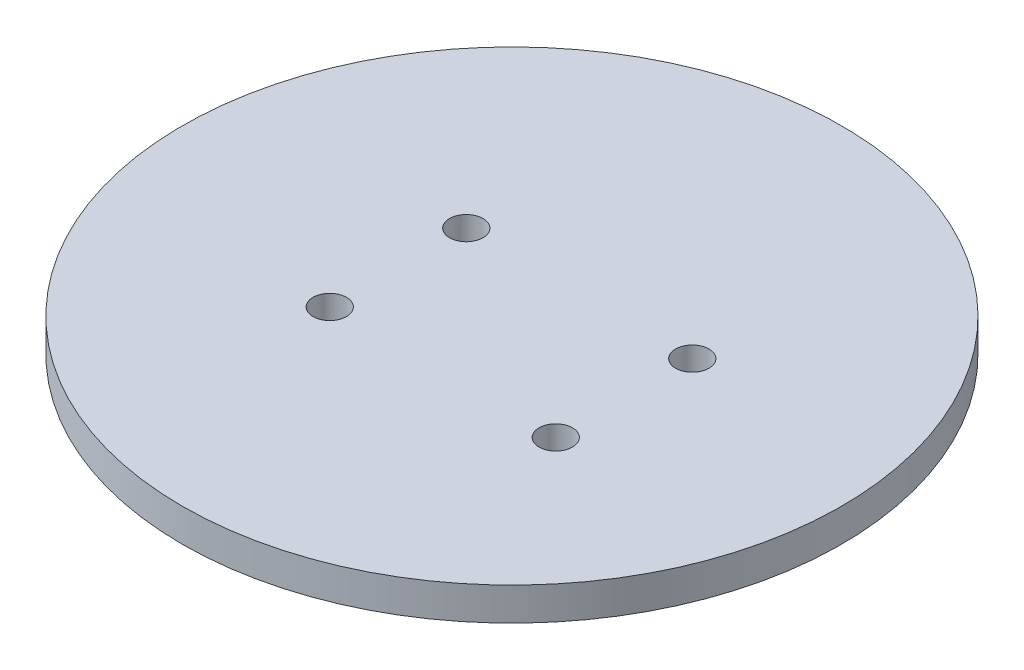
ISO-10303-21;
HEADER;
FILE_DESCRIPTION(('STEP AP214'),'2;1');
FILE_NAME('part.step','',(''),(''),'','','');
FILE_SCHEMA(('AUTOMOTIVE_DESIGN { 1 0 10303 214 1 1 1 1 }'));
ENDSEC;
DATA;
#1=APPLICATION_CONTEXT('core data for automotive mechanical design processes');
#2=APPLICATION_PROTOCOL_DEFINITION('international standard','automotive_design',2000,#1);
#3=PRODUCT_CONTEXT('',#1,'mechanical');
#4=PRODUCT('Part','Part','',(#3));
#5=PRODUCT_RELATED_PRODUCT_CATEGORY('part','',(#4));
#6=PRODUCT_DEFINITION_FORMATION('','',#4);
#7=PRODUCT_DEFINITION_CONTEXT('part definition',#1,'design');
#8=PRODUCT_DEFINITION('design','',#6,#7);
#9=PRODUCT_DEFINITION_SHAPE('','',#8);
#10=(LENGTH_UNIT() NAMED_UNIT(*) SI_UNIT(.MILLI.,.METRE.));
#11=(NAMED_UNIT(*) PLANE_ANGLE_UNIT() SI_UNIT($,.RADIAN.));
#12=(NAMED_UNIT(*) SI_UNIT($,.STERADIAN.) SOLID_ANGLE_UNIT());
#13=UNCERTAINTY_MEASURE_WITH_UNIT(LENGTH_MEASURE(1.E-05),#10,'distance_accuracy_value','');
#14=(GEOMETRIC_REPRESENTATION_CONTEXT(3) GLOBAL_UNCERTAINTY_ASSIGNED_CONTEXT((#13)) GLOBAL_UNIT_ASSIGNED_CONTEXT((#10,
#11,#12)) REPRESENTATION_CONTEXT('',''));
#15=CARTESIAN_POINT('',(0.,0.,0.));
#16=DIRECTION('',(0.,0.,1.));
#17=DIRECTION('',(1.,0.,0.));
#18=AXIS2_PLACEMENT_3D('',#15,#16,#17);
#19=CARTESIAN_POINT('',(0.,-10.2,0.));
#20=DIRECTION('',(0.,1.,0.));
#21=DIRECTION('',(0.,0.,1.));
#22=AXIS2_PLACEMENT_3D('',#19,#20,#21);
#23=PLANE('',#22);
#24=DIRECTION('',(1.,0.,0.));
#25=VECTOR('',#24,1.);
#26=CARTESIAN_POINT('',(2.90000000000001,-10.2,1.6732398693527));
#27=LINE('',#26,#25);
#28=CARTESIAN_POINT('',(-2.89999999999999,-10.2,1.6732398693527));
#29=VERTEX_POINT('',#28);
#30=CARTESIAN_POINT('',(2.90000000000001,-10.2,1.6732398693527));
#31=VERTEX_POINT('',#30);
#32=EDGE_CURVE('E244',#29,#31,#27,.T.);
#33=ORIENTED_EDGE('',*,*,#32,.T.);
#34=DIRECTION('',(0.,0.,-1.));
#35=VECTOR('',#34,1.);
#36=CARTESIAN_POINT('',(2.90000000000001,-10.2,1.6732398693527));
#37=LINE('',#36,#35);
#38=CARTESIAN_POINT('',(2.90000000000001,-10.2,-1.7267601306473));
#39=VERTEX_POINT('',#38);
#40=EDGE_CURVE('E234',#31,#39,#37,.T.);
#41=ORIENTED_EDGE('',*,*,#40,.T.);
#42=DIRECTION('',(-1.,0.,0.));
#43=VECTOR('',#42,1.);
#44=CARTESIAN_POINT('',(2.90000000000001,-10.2,-1.7267601306473));
#45=LINE('',#44,#43);
#46=CARTESIAN_POINT('',(-2.89999999999999,-10.2,-1.7267601306473));
#47=VERTEX_POINT('',#46);
#48=EDGE_CURVE('E237',#39,#47,#45,.T.);
#49=ORIENTED_EDGE('',*,*,#48,.T.);
#50=DIRECTION('',(0.,0.,1.));
#51=VECTOR('',#50,1.);
#52=CARTESIAN_POINT('',(-2.89999999999999,-10.2,1.6732398693527));
#53=LINE('',#52,#51);
#54=EDGE_CURVE('E241',#47,#29,#53,.T.);
#55=ORIENTED_EDGE('',*,*,#54,.T.);
#56=EDGE_LOOP('',(#33,#41,#49,#55));
#57=FACE_BOUND('',#56,.T.);
#58=DIRECTION('',(1.,0.,0.));
#59=VECTOR('',#58,1.);
#60=CARTESIAN_POINT('',(0.,-10.2,2.6732398693527));
#61=LINE('',#60,#59);
#62=CARTESIAN_POINT('',(-2.55808299335717,-10.2,2.6732398693527));
#63=VERTEX_POINT('',#62);
#64=CARTESIAN_POINT('',(2.55808299335717,-10.2,2.6732398693527));
#65=VERTEX_POINT('',#64);
#66=EDGE_CURVE('E177',#63,#65,#61,.T.);
#67=ORIENTED_EDGE('',*,*,#66,.F.);
#68=CARTESIAN_POINT('',(0.,-10.2,0.));
#69=DIRECTION('',(0.,-1.,0.));
#70=DIRECTION('',(0.,0.,-1.));
#71=AXIS2_PLACEMENT_3D('',#68,#69,#70);
#72=CIRCLE('',#71,3.7);
#73=CARTESIAN_POINT('',(-2.50095565532704,-10.2,-2.7267601306473));
#74=VERTEX_POINT('',#73);
#75=EDGE_CURVE('E153',#63,#74,#72,.T.);
#76=ORIENTED_EDGE('',*,*,#75,.T.);
#77=DIRECTION('',(-1.,0.,0.));
#78=VECTOR('',#77,1.);
#79=CARTESIAN_POINT('',(0.,-10.2,-2.7267601306473));
#80=LINE('',#79,#78);
#81=CARTESIAN_POINT('',(2.50095565532704,-10.2,-2.7267601306473));
#82=VERTEX_POINT('',#81);
#83=EDGE_CURVE('E167',#82,#74,#80,.T.);
#84=ORIENTED_EDGE('',*,*,#83,.F.);
#85=EDGE_CURVE('E155',#82,#65,#72,.T.);
#86=ORIENTED_EDGE('',*,*,#85,.T.);
#87=EDGE_LOOP('',(#67,#76,#84,#86));
#88=FACE_BOUND('',#87,.T.);
#89=ADVANCED_FACE('F46',(#57,#88),#23,.F.);
#90=CARTESIAN_POINT('',(0.,-11.2,0.));
#91=DIRECTION('',(0.,1.,0.));
#92=DIRECTION('',(0.,0.,1.));
#93=AXIS2_PLACEMENT_3D('',#90,#91,#92);
#94=CYLINDRICAL_SURFACE('',#93,4.25);
#95=CARTESIAN_POINT('',(0.,-2.2,0.));
#96=DIRECTION('',(0.,-1.,0.));
#97=DIRECTION('',(0.,0.,-1.));
#98=AXIS2_PLACEMENT_3D('',#95,#96,#97);
#99=CIRCLE('',#98,4.25);
#100=CARTESIAN_POINT('',(0.,-2.2,-4.25));
#101=VERTEX_POINT('',#100);
#102=EDGE_CURVE('E202',#101,#101,#99,.T.);
#103=ORIENTED_EDGE('',*,*,#102,.F.);
#104=EDGE_LOOP('',(#103));
#105=FACE_BOUND('',#104,.T.);
#106=DIRECTION('',(0.,1.,0.));
#107=VECTOR('',#106,1.);
#108=CARTESIAN_POINT('',(3.90000000000001,-11.2,-1.68893457540542));
#109=LINE('',#108,#107);
#110=CARTESIAN_POINT('',(3.90000000000001,-3.2,-1.68893457540542));
#111=VERTEX_POINT('',#110);
#112=CARTESIAN_POINT('',(3.90000000000001,-10.2,-1.68893457540542));
#113=VERTEX_POINT('',#112);
#114=EDGE_CURVE('E218',#111,#113,#109,.F.);
#115=ORIENTED_EDGE('',*,*,#114,.T.);
#116=CARTESIAN_POINT('',(0.,-10.2,0.));
#117=DIRECTION('',(0.,-1.,0.));
#118=DIRECTION('',(0.,0.,-1.));
#119=AXIS2_PLACEMENT_3D('',#116,#117,#118);
#120=CIRCLE('',#119,4.25);
#121=CARTESIAN_POINT('',(3.90000000000001,-10.2,1.68893457540544));
#122=VERTEX_POINT('',#121);
#123=EDGE_CURVE('E12',#113,#122,#120,.T.);
#124=ORIENTED_EDGE('',*,*,#123,.T.);
#125=DIRECTION('',(0.,1.,0.));
#126=VECTOR('',#125,1.);
#127=CARTESIAN_POINT('',(3.90000000000001,-11.2,1.68893457540544));
#128=LINE('',#127,#126);
#129=CARTESIAN_POINT('',(3.90000000000001,-3.2,1.68893457540544));
#130=VERTEX_POINT('',#129);
#131=EDGE_CURVE('E214',#122,#130,#128,.T.);
#132=ORIENTED_EDGE('',*,*,#131,.T.);
#133=CARTESIAN_POINT('',(0.,-3.2,0.));
#134=DIRECTION('',(0.,1.,0.));
#135=DIRECTION('',(0.,0.,1.));
#136=AXIS2_PLACEMENT_3D('',#133,#134,#135);
#137=CIRCLE('',#136,4.25);
#138=CARTESIAN_POINT('',(3.30398072041941,-3.2,2.6732398693527));
#139=VERTEX_POINT('',#138);
#140=EDGE_CURVE('E181',#130,#139,#137,.F.);
#141=ORIENTED_EDGE('',*,*,#140,.T.);
#142=DIRECTION('',(0.,1.,0.));
#143=VECTOR('',#142,1.);
#144=CARTESIAN_POINT('',(3.30398072041941,-11.2,2.6732398693527));
#145=LINE('',#144,#143);
#146=CARTESIAN_POINT('',(3.30398072041941,-10.2,2.6732398693527));
#147=VERTEX_POINT('',#146);
#148=EDGE_CURVE('E209',#139,#147,#145,.F.);
#149=ORIENTED_EDGE('',*,*,#148,.T.);
#150=CARTESIAN_POINT('',(-3.30398072041941,-10.2,2.6732398693527));
#151=VERTEX_POINT('',#150);
#152=EDGE_CURVE('E55',#147,#151,#120,.T.);
#153=ORIENTED_EDGE('',*,*,#152,.T.);
#154=DIRECTION('',(0.,1.,0.));
#155=VECTOR('',#154,1.);
#156=CARTESIAN_POINT('',(-3.30398072041941,-11.2,2.6732398693527));
#157=LINE('',#156,#155);
#158=CARTESIAN_POINT('',(-3.30398072041941,-3.2,2.6732398693527));
#159=VERTEX_POINT('',#158);
#160=EDGE_CURVE('E230',#151,#159,#157,.T.);
#161=ORIENTED_EDGE('',*,*,#160,.T.);
#162=CARTESIAN_POINT('',(-3.89999999999999,-3.2,1.68893457540549));
#163=VERTEX_POINT('',#162);
#164=EDGE_CURVE('E185',#159,#163,#137,.F.);
#165=ORIENTED_EDGE('',*,*,#164,.T.);
#166=DIRECTION('',(0.,1.,0.));
#167=VECTOR('',#166,1.);
#168=CARTESIAN_POINT('',(-3.89999999999999,-11.2,1.68893457540549));
#169=LINE('',#168,#167);
#170=CARTESIAN_POINT('',(-3.89999999999999,-10.2,1.68893457540549));
#171=VERTEX_POINT('',#170);
#172=EDGE_CURVE('E227',#163,#171,#169,.F.);
#173=ORIENTED_EDGE('',*,*,#172,.T.);
#174=CARTESIAN_POINT('',(-3.89999999999999,-10.2,-1.68893457540549));
#175=VERTEX_POINT('',#174);
#176=EDGE_CURVE('E294',#171,#175,#120,.T.);
#177=ORIENTED_EDGE('',*,*,#176,.T.);
#178=DIRECTION('',(0.,1.,0.));
#179=VECTOR('',#178,1.);
#180=CARTESIAN_POINT('',(-3.89999999999999,-11.2,-1.68893457540549));
#181=LINE('',#180,#179);
#182=CARTESIAN_POINT('',(-3.89999999999999,-3.2,-1.68893457540549));
#183=VERTEX_POINT('',#182);
#184=EDGE_CURVE('E224',#175,#183,#181,.T.);
#185=ORIENTED_EDGE('',*,*,#184,.T.);
#186=CARTESIAN_POINT('',(-3.25995079562749,-3.2,-2.7267601306473));
#187=VERTEX_POINT('',#186);
#188=EDGE_CURVE('E291',#183,#187,#137,.F.);
#189=ORIENTED_EDGE('',*,*,#188,.T.);
#190=DIRECTION('',(0.,1.,0.));
#191=VECTOR('',#190,1.);
#192=CARTESIAN_POINT('',(-3.25995079562749,-11.2,-2.7267601306473));
#193=LINE('',#192,#191);
#194=CARTESIAN_POINT('',(-3.25995079562749,-10.2,-2.7267601306473));
#195=VERTEX_POINT('',#194);
#196=EDGE_CURVE('E221',#187,#195,#193,.F.);
#197=ORIENTED_EDGE('',*,*,#196,.T.);
#198=CARTESIAN_POINT('',(3.25995079562749,-10.2,-2.7267601306473));
#199=VERTEX_POINT('',#198);
#200=EDGE_CURVE('E50',#195,#199,#120,.T.);
#201=ORIENTED_EDGE('',*,*,#200,.T.);
#202=DIRECTION('',(0.,1.,0.));
#203=VECTOR('',#202,1.);
#204=CARTESIAN_POINT('',(3.25995079562749,-11.2,-2.7267601306473));
#205=LINE('',#204,#203);
#206=CARTESIAN_POINT('',(3.25995079562749,-3.2,-2.7267601306473));
#207=VERTEX_POINT('',#206);
#208=EDGE_CURVE('E176',#199,#207,#205,.T.);
#209=ORIENTED_EDGE('',*,*,#208,.T.);
#210=EDGE_CURVE('E183',#207,#111,#137,.F.);
#211=ORIENTED_EDGE('',*,*,#210,.T.);
#212=EDGE_LOOP('',(#115,#124,#132,#141,#149,#153,#161,#165,#173,#177,#185,#189,#197,#201,#209,#211));
#213=FACE_BOUND('',#212,.T.);
#214=ADVANCED_FACE('F283',(#105,#213),#94,.F.);
#215=CARTESIAN_POINT('',(0.,-3.2,0.));
#216=DIRECTION('',(0.,1.,0.));
#217=DIRECTION('',(0.,0.,1.));
#218=AXIS2_PLACEMENT_3D('',#215,#216,#217);
#219=PLANE('',#218);
#220=ORIENTED_EDGE('',*,*,#164,.F.);
#221=DIRECTION('',(1.,0.,0.));
#222=VECTOR('',#221,1.);
#223=CARTESIAN_POINT('',(0.,-3.2,2.6732398693527));
#224=LINE('',#223,#222);
#225=EDGE_CURVE('E268',#159,#139,#224,.T.);
#226=ORIENTED_EDGE('',*,*,#225,.T.);
#227=ORIENTED_EDGE('',*,*,#140,.F.);
#228=DIRECTION('',(0.,0.,-1.));
#229=VECTOR('',#228,1.);
#230=CARTESIAN_POINT('',(3.90000000000001,-3.2,0.));
#231=LINE('',#230,#229);
#232=EDGE_CURVE('E260',#130,#111,#231,.T.);
#233=ORIENTED_EDGE('',*,*,#232,.T.);
#234=ORIENTED_EDGE('',*,*,#210,.F.);
#235=DIRECTION('',(-1.,0.,0.));
#236=VECTOR('',#235,1.);
#237=CARTESIAN_POINT('',(0.,-3.2,-2.7267601306473));
#238=LINE('',#237,#236);
#239=EDGE_CURVE('E267',#207,#187,#238,.T.);
#240=ORIENTED_EDGE('',*,*,#239,.T.);
#241=ORIENTED_EDGE('',*,*,#188,.F.);
#242=DIRECTION('',(0.,0.,1.));
#243=VECTOR('',#242,1.);
#244=CARTESIAN_POINT('',(-3.89999999999999,-3.2,0.));
#245=LINE('',#244,#243);
#246=EDGE_CURVE('E270',#183,#163,#245,.T.);
#247=ORIENTED_EDGE('',*,*,#246,.T.);
#248=EDGE_LOOP('',(#220,#226,#227,#233,#234,#240,#241,#247));
#249=FACE_BOUND('',#248,.T.);
#250=ADVANCED_FACE('F48',(#249),#219,.T.);
#251=CARTESIAN_POINT('',(3.90000000000001,-10.2,1.6732398693527));
#252=DIRECTION('',(1.,0.,0.));
#253=DIRECTION('',(0.,0.,-1.));
#254=AXIS2_PLACEMENT_3D('',#251,#252,#253);
#255=PLANE('',#254);
#256=ORIENTED_EDGE('',*,*,#114,.F.);
#257=ORIENTED_EDGE('',*,*,#232,.F.);
#258=ORIENTED_EDGE('',*,*,#131,.F.);
#259=DIRECTION('',(0.,0.,-1.));
#260=VECTOR('',#259,1.);
#261=CARTESIAN_POINT('',(3.90000000000001,-10.2,0.));
#262=LINE('',#261,#260);
#263=EDGE_CURVE('E169',#122,#113,#262,.T.);
#264=ORIENTED_EDGE('',*,*,#263,.T.);
#265=EDGE_LOOP('',(#256,#257,#258,#264));
#266=FACE_BOUND('',#265,.T.);
#267=ADVANCED_FACE('F289',(#266),#255,.T.);
#268=CARTESIAN_POINT('',(2.90000000000001,-10.2,2.6732398693527));
#269=DIRECTION('',(0.,0.,1.));
#270=DIRECTION('',(1.,0.,0.));
#271=AXIS2_PLACEMENT_3D('',#268,#269,#270);
#272=PLANE('',#271);
#273=ORIENTED_EDGE('',*,*,#148,.F.);
#274=ORIENTED_EDGE('',*,*,#225,.F.);
#275=ORIENTED_EDGE('',*,*,#160,.F.);
#276=EDGE_CURVE('E184',#151,#63,#61,.T.);
#277=ORIENTED_EDGE('',*,*,#276,.T.);
#278=ORIENTED_EDGE('',*,*,#66,.T.);
#279=DIRECTION('',(1.,0.,0.));
#280=VECTOR('',#279,1.);
#281=CARTESIAN_POINT('',(2.90000000000001,-10.2,2.6732398693527));
#282=LINE('',#281,#280);
#283=EDGE_CURVE('E191',#65,#147,#282,.T.);
#284=ORIENTED_EDGE('',*,*,#283,.T.);
#285=EDGE_LOOP('',(#273,#274,#275,#277,#278,#284));
#286=FACE_BOUND('',#285,.T.);
#287=ADVANCED_FACE('F278',(#286),#272,.T.);
#288=CARTESIAN_POINT('',(-3.89999999999999,-10.2,1.6732398693527));
#289=DIRECTION('',(-1.,0.,0.));
#290=DIRECTION('',(0.,0.,1.));
#291=AXIS2_PLACEMENT_3D('',#288,#289,#290);
#292=PLANE('',#291);
#293=ORIENTED_EDGE('',*,*,#172,.F.);
#294=ORIENTED_EDGE('',*,*,#246,.F.);
#295=ORIENTED_EDGE('',*,*,#184,.F.);
#296=DIRECTION('',(0.,0.,1.));
#297=VECTOR('',#296,1.);
#298=CARTESIAN_POINT('',(-3.89999999999999,-10.2,0.));
#299=LINE('',#298,#297);
#300=EDGE_CURVE('E69',#175,#171,#299,.T.);
#301=ORIENTED_EDGE('',*,*,#300,.T.);
#302=EDGE_LOOP('',(#293,#294,#295,#301));
#303=FACE_BOUND('',#302,.T.);
#304=ADVANCED_FACE('F299',(#303),#292,.T.);
#305=CARTESIAN_POINT('',(2.90000000000001,-10.2,-2.7267601306473));
#306=DIRECTION('',(0.,0.,-1.));
#307=DIRECTION('',(-1.,0.,0.));
#308=AXIS2_PLACEMENT_3D('',#305,#306,#307);
#309=PLANE('',#308);
#310=ORIENTED_EDGE('',*,*,#196,.F.);
#311=ORIENTED_EDGE('',*,*,#239,.F.);
#312=ORIENTED_EDGE('',*,*,#208,.F.);
#313=EDGE_CURVE('E62',#199,#82,#80,.T.);
#314=ORIENTED_EDGE('',*,*,#313,.T.);
#315=ORIENTED_EDGE('',*,*,#83,.T.);
#316=DIRECTION('',(-1.,0.,0.));
#317=VECTOR('',#316,1.);
#318=CARTESIAN_POINT('',(2.90000000000001,-10.2,-2.7267601306473));
#319=LINE('',#318,#317);
#320=EDGE_CURVE('E150',#74,#195,#319,.T.);
#321=ORIENTED_EDGE('',*,*,#320,.T.);
#322=EDGE_LOOP('',(#310,#311,#312,#314,#315,#321));
#323=FACE_BOUND('',#322,.T.);
#324=ADVANCED_FACE('F173',(#323),#309,.T.);
#325=CARTESIAN_POINT('',(2.90000000000001,-10.2,1.6732398693527));
#326=DIRECTION('',(1.,0.,0.));
#327=DIRECTION('',(0.,0.,-1.));
#328=AXIS2_PLACEMENT_3D('',#325,#326,#327);
#329=PLANE('',#328);
#330=DIRECTION('',(0.,0.,-1.));
#331=VECTOR('',#330,1.);
#332=CARTESIAN_POINT('',(2.90000000000001,-4.2,1.6732398693527));
#333=LINE('',#332,#331);
#334=CARTESIAN_POINT('',(2.90000000000001,-4.2,1.6732398693527));
#335=VERTEX_POINT('',#334);
#336=CARTESIAN_POINT('',(2.90000000000001,-4.2,-1.7267601306473));
#337=VERTEX_POINT('',#336);
#338=EDGE_CURVE('E233',#335,#337,#333,.T.);
#339=ORIENTED_EDGE('',*,*,#338,.T.);
#340=DIRECTION('',(0.,1.,0.));
#341=VECTOR('',#340,1.);
#342=CARTESIAN_POINT('',(2.90000000000001,-10.2,-1.7267601306473));
#343=LINE('',#342,#341);
#344=EDGE_CURVE('E247',#39,#337,#343,.T.);
#345=ORIENTED_EDGE('',*,*,#344,.F.);
#346=ORIENTED_EDGE('',*,*,#40,.F.);
#347=DIRECTION('',(0.,1.,0.));
#348=VECTOR('',#347,1.);
#349=CARTESIAN_POINT('',(2.90000000000001,-10.2,1.6732398693527));
#350=LINE('',#349,#348);
#351=EDGE_CURVE('E258',#31,#335,#350,.T.);
#352=ORIENTED_EDGE('',*,*,#351,.T.);
#353=EDGE_LOOP('',(#339,#345,#346,#352));
#354=FACE_BOUND('',#353,.T.);
#355=ADVANCED_FACE('F306',(#354),#329,.F.);
#356=CARTESIAN_POINT('',(2.90000000000001,-10.2,1.6732398693527));
#357=DIRECTION('',(0.,0.,1.));
#358=DIRECTION('',(1.,0.,0.));
#359=AXIS2_PLACEMENT_3D('',#356,#357,#358);
#360=PLANE('',#359);
#361=DIRECTION('',(1.,0.,0.));
#362=VECTOR('',#361,1.);
#363=CARTESIAN_POINT('',(2.90000000000001,-4.2,1.6732398693527));
#364=LINE('',#363,#362);
#365=CARTESIAN_POINT('',(-2.89999999999999,-4.2,1.6732398693527));
#366=VERTEX_POINT('',#365);
#367=EDGE_CURVE('E238',#366,#335,#364,.T.);
#368=ORIENTED_EDGE('',*,*,#367,.T.);
#369=ORIENTED_EDGE('',*,*,#351,.F.);
#370=ORIENTED_EDGE('',*,*,#32,.F.);
#371=DIRECTION('',(0.,1.,0.));
#372=VECTOR('',#371,1.);
#373=CARTESIAN_POINT('',(-2.89999999999999,-10.2,1.6732398693527));
#374=LINE('',#373,#372);
#375=EDGE_CURVE('E261',#29,#366,#374,.T.);
#376=ORIENTED_EDGE('',*,*,#375,.T.);
#377=EDGE_LOOP('',(#368,#369,#370,#376));
#378=FACE_BOUND('',#377,.T.);
#379=ADVANCED_FACE('F446',(#378),#360,.F.);
#380=CARTESIAN_POINT('',(-2.89999999999999,-10.2,1.6732398693527));
#381=DIRECTION('',(-1.,0.,0.));
#382=DIRECTION('',(0.,0.,1.));
#383=AXIS2_PLACEMENT_3D('',#380,#381,#382);
#384=PLANE('',#383);
#385=DIRECTION('',(0.,0.,1.));
#386=VECTOR('',#385,1.);
#387=CARTESIAN_POINT('',(-2.89999999999999,-4.2,1.6732398693527));
#388=LINE('',#387,#386);
#389=CARTESIAN_POINT('',(-2.89999999999999,-4.2,-1.7267601306473));
#390=VERTEX_POINT('',#389);
#391=EDGE_CURVE('E253',#390,#366,#388,.T.);
#392=ORIENTED_EDGE('',*,*,#391,.T.);
#393=ORIENTED_EDGE('',*,*,#375,.F.);
#394=ORIENTED_EDGE('',*,*,#54,.F.);
#395=DIRECTION('',(0.,1.,0.));
#396=VECTOR('',#395,1.);
#397=CARTESIAN_POINT('',(-2.89999999999999,-10.2,-1.7267601306473));
#398=LINE('',#397,#396);
#399=EDGE_CURVE('E263',#47,#390,#398,.T.);
#400=ORIENTED_EDGE('',*,*,#399,.T.);
#401=EDGE_LOOP('',(#392,#393,#394,#400));
#402=FACE_BOUND('',#401,.T.);
#403=ADVANCED_FACE('F449',(#402),#384,.F.);
#404=CARTESIAN_POINT('',(2.90000000000001,-10.2,-1.7267601306473));
#405=DIRECTION('',(0.,0.,-1.));
#406=DIRECTION('',(-1.,0.,0.));
#407=AXIS2_PLACEMENT_3D('',#404,#405,#406);
#408=PLANE('',#407);
#409=DIRECTION('',(-1.,0.,0.));
#410=VECTOR('',#409,1.);
#411=CARTESIAN_POINT('',(2.90000000000001,-4.2,-1.7267601306473));
#412=LINE('',#411,#410);
#413=EDGE_CURVE('E250',#337,#390,#412,.T.);
#414=ORIENTED_EDGE('',*,*,#413,.T.);
#415=ORIENTED_EDGE('',*,*,#399,.F.);
#416=ORIENTED_EDGE('',*,*,#48,.F.);
#417=ORIENTED_EDGE('',*,*,#344,.T.);
#418=EDGE_LOOP('',(#414,#415,#416,#417));
#419=FACE_BOUND('',#418,.T.);
#420=ADVANCED_FACE('F444',(#419),#408,.F.);
#421=CARTESIAN_POINT('',(0.,-4.2,0.));
#422=DIRECTION('',(0.,1.,0.));
#423=DIRECTION('',(0.,0.,1.));
#424=AXIS2_PLACEMENT_3D('',#421,#422,#423);
#425=PLANE('',#424);
#426=ORIENTED_EDGE('',*,*,#338,.F.);
#427=ORIENTED_EDGE('',*,*,#367,.F.);
#428=ORIENTED_EDGE('',*,*,#391,.F.);
#429=ORIENTED_EDGE('',*,*,#413,.F.);
#430=EDGE_LOOP('',(#426,#427,#428,#429));
#431=FACE_BOUND('',#430,.T.);
#432=ADVANCED_FACE('F368',(#431),#425,.F.);
#433=CARTESIAN_POINT('',(0.,-11.2,0.));
#434=DIRECTION('',(0.,-1.,0.));
#435=DIRECTION('',(0.,0.,-1.));
#436=AXIS2_PLACEMENT_3D('',#433,#434,#435);
#437=PLANE('',#436);
#438=CARTESIAN_POINT('',(0.,-11.2,0.));
#439=DIRECTION('',(0.,-1.,0.));
#440=DIRECTION('',(0.,0.,-1.));
#441=AXIS2_PLACEMENT_3D('',#438,#439,#440);
#442=CIRCLE('',#441,4.5);
#443=CARTESIAN_POINT('',(0.,-11.2,-4.5));
#444=VERTEX_POINT('',#443);
#445=EDGE_CURVE('E186',#444,#444,#442,.F.);
#446=ORIENTED_EDGE('',*,*,#445,.T.);
#447=EDGE_LOOP('',(#446));
#448=FACE_BOUND('',#447,.T.);
#449=CARTESIAN_POINT('',(0.,-11.2,0.));
#450=DIRECTION('',(0.,-1.,0.));
#451=DIRECTION('',(0.,0.,-1.));
#452=AXIS2_PLACEMENT_3D('',#449,#450,#451);
#453=CIRCLE('',#452,5.5);
#454=CARTESIAN_POINT('',(0.,-11.2,-5.5));
#455=VERTEX_POINT('',#454);
#456=EDGE_CURVE('E206',#455,#455,#453,.T.);
#457=ORIENTED_EDGE('',*,*,#456,.T.);
#458=EDGE_LOOP('',(#457));
#459=FACE_BOUND('',#458,.T.);
#460=ADVANCED_FACE('F362',(#448,#459),#437,.T.);
#461=CARTESIAN_POINT('',(0.,-2.2,0.));
#462=DIRECTION('',(0.,-1.,0.));
#463=DIRECTION('',(0.,0.,-1.));
#464=AXIS2_PLACEMENT_3D('',#461,#462,#463);
#465=PLANE('',#464);
#466=CARTESIAN_POINT('',(0.,-2.2,0.));
#467=DIRECTION('',(0.,-1.,0.));
#468=DIRECTION('',(0.,0.,-1.));
#469=AXIS2_PLACEMENT_3D('',#466,#467,#468);
#470=CIRCLE('',#469,5.5);
#471=CARTESIAN_POINT('',(0.,-2.2,-5.5));
#472=VERTEX_POINT('',#471);
#473=EDGE_CURVE('E205',#472,#472,#470,.T.);
#474=ORIENTED_EDGE('',*,*,#473,.F.);
#475=EDGE_LOOP('',(#474));
#476=FACE_BOUND('',#475,.T.);
#477=ORIENTED_EDGE('',*,*,#102,.T.);
#478=EDGE_LOOP('',(#477));
#479=FACE_BOUND('',#478,.T.);
#480=ADVANCED_FACE('F367',(#476,#479),#465,.F.);
#481=CARTESIAN_POINT('',(0.,-11.2,0.));
#482=DIRECTION('',(0.,1.,0.));
#483=DIRECTION('',(0.,0.,1.));
#484=AXIS2_PLACEMENT_3D('',#481,#482,#483);
#485=CYLINDRICAL_SURFACE('',#484,5.5);
#486=ORIENTED_EDGE('',*,*,#456,.F.);
#487=EDGE_LOOP('',(#486));
#488=FACE_BOUND('',#487,.T.);
#489=ORIENTED_EDGE('',*,*,#473,.T.);
#490=EDGE_LOOP('',(#489));
#491=FACE_BOUND('',#490,.T.);
#492=ADVANCED_FACE('F381',(#488,#491),#485,.T.);
#493=CARTESIAN_POINT('',(0.,-14.2,0.));
#494=DIRECTION('',(0.,1.,0.));
#495=DIRECTION('',(0.,0.,1.));
#496=AXIS2_PLACEMENT_3D('',#493,#494,#495);
#497=CYLINDRICAL_SURFACE('',#496,3.7);
#498=CARTESIAN_POINT('',(0.,-14.2,0.));
#499=DIRECTION('',(0.,-1.,0.));
#500=DIRECTION('',(0.,0.,-1.));
#501=AXIS2_PLACEMENT_3D('',#498,#499,#500);
#502=CIRCLE('',#501,3.7);
#503=CARTESIAN_POINT('',(0.,-14.2,-3.7));
#504=VERTEX_POINT('',#503);
#505=EDGE_CURVE('E165',#504,#504,#502,.T.);
#506=ORIENTED_EDGE('',*,*,#505,.T.);
#507=EDGE_LOOP('',(#506));
#508=FACE_BOUND('',#507,.T.);
#509=ORIENTED_EDGE('',*,*,#85,.F.);
#510=EDGE_CURVE('E146',#74,#82,#72,.T.);
#511=ORIENTED_EDGE('',*,*,#510,.F.);
#512=ORIENTED_EDGE('',*,*,#75,.F.);
#513=EDGE_CURVE('E161',#65,#63,#72,.T.);
#514=ORIENTED_EDGE('',*,*,#513,.F.);
#515=EDGE_LOOP('',(#509,#511,#512,#514));
#516=FACE_BOUND('',#515,.T.);
#517=ADVANCED_FACE('F159',(#508,#516),#497,.F.);
#518=CARTESIAN_POINT('',(0.,-14.2,0.));
#519=DIRECTION('',(0.,1.,0.));
#520=DIRECTION('',(0.,0.,1.));
#521=AXIS2_PLACEMENT_3D('',#518,#519,#520);
#522=CYLINDRICAL_SURFACE('',#521,4.5);
#523=ORIENTED_EDGE('',*,*,#445,.F.);
#524=EDGE_LOOP('',(#523));
#525=FACE_BOUND('',#524,.T.);
#526=CARTESIAN_POINT('',(0.,-14.2,0.));
#527=DIRECTION('',(0.,-1.,0.));
#528=DIRECTION('',(0.,0.,-1.));
#529=AXIS2_PLACEMENT_3D('',#526,#527,#528);
#530=CIRCLE('',#529,4.5);
#531=CARTESIAN_POINT('',(0.,-14.2,-4.5));
#532=VERTEX_POINT('',#531);
#533=EDGE_CURVE('E188',#532,#532,#530,.T.);
#534=ORIENTED_EDGE('',*,*,#533,.F.);
#535=EDGE_LOOP('',(#534));
#536=FACE_BOUND('',#535,.T.);
#537=ADVANCED_FACE('F380',(#525,#536),#522,.T.);
#538=CARTESIAN_POINT('',(0.,-14.2,0.));
#539=DIRECTION('',(0.,-1.,0.));
#540=DIRECTION('',(0.,0.,-1.));
#541=AXIS2_PLACEMENT_3D('',#538,#539,#540);
#542=PLANE('',#541);
#543=ORIENTED_EDGE('',*,*,#533,.T.);
#544=EDGE_LOOP('',(#543));
#545=FACE_BOUND('',#544,.T.);
#546=ORIENTED_EDGE('',*,*,#505,.F.);
#547=EDGE_LOOP('',(#546));
#548=FACE_BOUND('',#547,.T.);
#549=ADVANCED_FACE('F392',(#545,#548),#542,.T.);
#550=CARTESIAN_POINT('',(0.,-10.2,0.));
#551=DIRECTION('',(0.,-1.,0.));
#552=DIRECTION('',(0.,0.,-1.));
#553=AXIS2_PLACEMENT_3D('',#550,#551,#552);
#554=PLANE('',#553);
#555=ORIENTED_EDGE('',*,*,#320,.F.);
#556=ORIENTED_EDGE('',*,*,#510,.T.);
#557=ORIENTED_EDGE('',*,*,#313,.F.);
#558=ORIENTED_EDGE('',*,*,#200,.F.);
#559=EDGE_LOOP('',(#555,#556,#557,#558));
#560=FACE_BOUND('',#559,.T.);
#561=ADVANCED_FACE('F148',(#560),#554,.F.);
#562=ORIENTED_EDGE('',*,*,#276,.F.);
#563=ORIENTED_EDGE('',*,*,#152,.F.);
#564=ORIENTED_EDGE('',*,*,#283,.F.);
#565=ORIENTED_EDGE('',*,*,#513,.T.);
#566=EDGE_LOOP('',(#562,#563,#564,#565));
#567=FACE_BOUND('',#566,.T.);
#568=ADVANCED_FACE('F410',(#567),#554,.F.);
#569=ORIENTED_EDGE('',*,*,#300,.F.);
#570=ORIENTED_EDGE('',*,*,#176,.F.);
#571=EDGE_LOOP('',(#569,#570));
#572=FACE_BOUND('',#571,.T.);
#573=ADVANCED_FACE('F413',(#572),#554,.F.);
#574=ORIENTED_EDGE('',*,*,#263,.F.);
#575=ORIENTED_EDGE('',*,*,#123,.F.);
#576=EDGE_LOOP('',(#574,#575));
#577=FACE_BOUND('',#576,.T.);
#578=ADVANCED_FACE('F412',(#577),#554,.F.);
#579=CLOSED_SHELL('',(#89,#214,#250,#267,#287,#304,#324,#355,#379,#403,#420,#432,#460,#480,#492,
#517,#537,#549,#561,#568,#573,#578));
#580=MANIFOLD_SOLID_BREP('B2',#579);
#581=CARTESIAN_POINT('',(0.,3.5,0.));
#582=DIRECTION('',(0.,-1.,0.));
#583=DIRECTION('',(0.,0.,-1.));
#584=AXIS2_PLACEMENT_3D('',#581,#582,#583);
#585=CYLINDRICAL_SURFACE('',#584,35.);
#586=CARTESIAN_POINT('',(0.,3.5,0.));
#587=DIRECTION('',(0.,1.,0.));
#588=DIRECTION('',(0.,0.,1.));
#589=AXIS2_PLACEMENT_3D('',#586,#587,#588);
#590=CIRCLE('',#589,35.);
#591=CARTESIAN_POINT('',(0.,3.5,35.));
#592=VERTEX_POINT('',#591);
#593=EDGE_CURVE('E522',#592,#592,#590,.T.);
#594=ORIENTED_EDGE('',*,*,#593,.F.);
#595=EDGE_LOOP('',(#594));
#596=FACE_BOUND('',#595,.T.);
#597=CARTESIAN_POINT('',(0.,0.,0.));
#598=DIRECTION('',(0.,1.,0.));
#599=DIRECTION('',(0.,0.,1.));
#600=AXIS2_PLACEMENT_3D('',#597,#598,#599);
#601=CIRCLE('',#600,35.);
#602=CARTESIAN_POINT('',(0.,0.,35.));
#603=VERTEX_POINT('',#602);
#604=EDGE_CURVE('E518',#603,#603,#601,.T.);
#605=ORIENTED_EDGE('',*,*,#604,.T.);
#606=EDGE_LOOP('',(#605));
#607=FACE_BOUND('',#606,.T.);
#608=ADVANCED_FACE('F515',(#596,#607),#585,.T.);
#609=CARTESIAN_POINT('',(0.,3.5,0.));
#610=DIRECTION('',(0.,1.,0.));
#611=DIRECTION('',(0.,0.,1.));
#612=AXIS2_PLACEMENT_3D('',#609,#610,#611);
#613=PLANE('',#612);
#614=CARTESIAN_POINT('',(-10.5051971388643,3.5,8.84169564699485));
#615=DIRECTION('',(0.,1.,0.));
#616=DIRECTION('',(0.,0.,1.));
#617=AXIS2_PLACEMENT_3D('',#614,#615,#616);
#618=CIRCLE('',#617,1.775);
#619=CARTESIAN_POINT('',(-10.5051971388643,3.5,10.6166956469948));
#620=VERTEX_POINT('',#619);
#621=EDGE_CURVE('E542',#620,#620,#618,.T.);
#622=ORIENTED_EDGE('',*,*,#621,.F.);
#623=EDGE_LOOP('',(#622));
#624=FACE_BOUND('',#623,.T.);
#625=CARTESIAN_POINT('',(13.4948028611357,3.5,8.84169564699485));
#626=DIRECTION('',(0.,1.,0.));
#627=DIRECTION('',(0.,0.,1.));
#628=AXIS2_PLACEMENT_3D('',#625,#626,#627);
#629=CIRCLE('',#628,1.775);
#630=CARTESIAN_POINT('',(13.4948028611357,3.5,10.6166956469948));
#631=VERTEX_POINT('',#630);
#632=EDGE_CURVE('E541',#631,#631,#629,.T.);
#633=ORIENTED_EDGE('',*,*,#632,.F.);
#634=EDGE_LOOP('',(#633));
#635=FACE_BOUND('',#634,.T.);
#636=CARTESIAN_POINT('',(13.4948028611356,3.5,-5.65830435300516));
#637=DIRECTION('',(0.,1.,0.));
#638=DIRECTION('',(0.,0.,1.));
#639=AXIS2_PLACEMENT_3D('',#636,#637,#638);
#640=CIRCLE('',#639,1.775);
#641=CARTESIAN_POINT('',(13.4948028611356,3.5,-3.88330435300515));
#642=VERTEX_POINT('',#641);
#643=EDGE_CURVE('E548',#642,#642,#640,.T.);
#644=ORIENTED_EDGE('',*,*,#643,.F.);
#645=EDGE_LOOP('',(#644));
#646=FACE_BOUND('',#645,.T.);
#647=CARTESIAN_POINT('',(-10.5051971388644,3.5,-5.65830435300516));
#648=DIRECTION('',(0.,1.,0.));
#649=DIRECTION('',(0.,0.,1.));
#650=AXIS2_PLACEMENT_3D('',#647,#648,#649);
#651=CIRCLE('',#650,1.775);
#652=CARTESIAN_POINT('',(-10.5051971388644,3.5,-3.88330435300515));
#653=VERTEX_POINT('',#652);
#654=EDGE_CURVE('E534',#653,#653,#651,.T.);
#655=ORIENTED_EDGE('',*,*,#654,.F.);
#656=EDGE_LOOP('',(#655));
#657=FACE_BOUND('',#656,.T.);
#658=ORIENTED_EDGE('',*,*,#593,.T.);
#659=EDGE_LOOP('',(#658));
#660=FACE_BOUND('',#659,.T.);
#661=ADVANCED_FACE('F559',(#624,#635,#646,#657,#660),#613,.T.);
#662=CARTESIAN_POINT('',(0.,0.,0.));
#663=DIRECTION('',(0.,1.,0.));
#664=DIRECTION('',(0.,0.,1.));
#665=AXIS2_PLACEMENT_3D('',#662,#663,#664);
#666=PLANE('',#665);
#667=CARTESIAN_POINT('',(0.,0.,0.));
#668=DIRECTION('',(0.,-1.,0.));
#669=DIRECTION('',(0.,0.,-1.));
#670=AXIS2_PLACEMENT_3D('',#667,#668,#669);
#671=CIRCLE('',#670,29.);
#672=CARTESIAN_POINT('',(0.,0.,-29.));
#673=VERTEX_POINT('',#672);
#674=EDGE_CURVE('E45',#673,#673,#671,.T.);
#675=ORIENTED_EDGE('',*,*,#674,.F.);
#676=EDGE_LOOP('',(#675));
#677=FACE_BOUND('',#676,.T.);
#678=ORIENTED_EDGE('',*,*,#604,.F.);
#679=EDGE_LOOP('',(#678));
#680=FACE_BOUND('',#679,.T.);
#681=ADVANCED_FACE('F562',(#677,#680),#666,.F.);
#682=CARTESIAN_POINT('',(0.,-2.2,0.));
#683=DIRECTION('',(0.,1.,0.));
#684=DIRECTION('',(0.,0.,1.));
#685=AXIS2_PLACEMENT_3D('',#682,#683,#684);
#686=CYLINDRICAL_SURFACE('',#685,29.);
#687=CARTESIAN_POINT('',(0.,-2.2,0.));
#688=DIRECTION('',(0.,-1.,0.));
#689=DIRECTION('',(0.,0.,-1.));
#690=AXIS2_PLACEMENT_3D('',#687,#688,#689);
#691=CIRCLE('',#690,29.);
#692=CARTESIAN_POINT('',(0.,-2.2,-29.));
#693=VERTEX_POINT('',#692);
#694=EDGE_CURVE('E528',#693,#693,#691,.T.);
#695=ORIENTED_EDGE('',*,*,#694,.F.);
#696=EDGE_LOOP('',(#695));
#697=FACE_BOUND('',#696,.T.);
#698=ORIENTED_EDGE('',*,*,#674,.T.);
#699=EDGE_LOOP('',(#698));
#700=FACE_BOUND('',#699,.T.);
#701=ADVANCED_FACE('F575',(#697,#700),#686,.T.);
#702=CARTESIAN_POINT('',(0.,-2.2,0.));
#703=DIRECTION('',(0.,-1.,0.));
#704=DIRECTION('',(0.,0.,-1.));
#705=AXIS2_PLACEMENT_3D('',#702,#703,#704);
#706=PLANE('',#705);
#707=CARTESIAN_POINT('',(-10.5051971388643,-2.2,8.84169564699485));
#708=DIRECTION('',(0.,-1.,0.));
#709=DIRECTION('',(0.,0.,-1.));
#710=AXIS2_PLACEMENT_3D('',#707,#708,#709);
#711=CIRCLE('',#710,1.775);
#712=CARTESIAN_POINT('',(-10.5051971388643,-2.2,7.06669564699485));
#713=VERTEX_POINT('',#712);
#714=EDGE_CURVE('E538',#713,#713,#711,.F.);
#715=ORIENTED_EDGE('',*,*,#714,.T.);
#716=EDGE_LOOP('',(#715));
#717=FACE_BOUND('',#716,.T.);
#718=CARTESIAN_POINT('',(13.4948028611357,-2.2,8.84169564699485));
#719=DIRECTION('',(0.,-1.,0.));
#720=DIRECTION('',(0.,0.,-1.));
#721=AXIS2_PLACEMENT_3D('',#718,#719,#720);
#722=CIRCLE('',#721,1.775);
#723=CARTESIAN_POINT('',(13.4948028611357,-2.2,7.06669564699485));
#724=VERTEX_POINT('',#723);
#725=EDGE_CURVE('E545',#724,#724,#722,.F.);
#726=ORIENTED_EDGE('',*,*,#725,.T.);
#727=EDGE_LOOP('',(#726));
#728=FACE_BOUND('',#727,.T.);
#729=CARTESIAN_POINT('',(13.4948028611356,-2.2,-5.65830435300516));
#730=DIRECTION('',(0.,-1.,0.));
#731=DIRECTION('',(0.,0.,-1.));
#732=AXIS2_PLACEMENT_3D('',#729,#730,#731);
#733=CIRCLE('',#732,1.775);
#734=CARTESIAN_POINT('',(13.4948028611356,-2.2,-7.43330435300516));
#735=VERTEX_POINT('',#734);
#736=EDGE_CURVE('E537',#735,#735,#733,.F.);
#737=ORIENTED_EDGE('',*,*,#736,.T.);
#738=EDGE_LOOP('',(#737));
#739=FACE_BOUND('',#738,.T.);
#740=CARTESIAN_POINT('',(-10.5051971388644,-2.2,-5.65830435300516));
#741=DIRECTION('',(0.,-1.,0.));
#742=DIRECTION('',(0.,0.,-1.));
#743=AXIS2_PLACEMENT_3D('',#740,#741,#742);
#744=CIRCLE('',#743,1.775);
#745=CARTESIAN_POINT('',(-10.5051971388644,-2.2,-7.43330435300516));
#746=VERTEX_POINT('',#745);
#747=EDGE_CURVE('E531',#746,#746,#744,.F.);
#748=ORIENTED_EDGE('',*,*,#747,.T.);
#749=EDGE_LOOP('',(#748));
#750=FACE_BOUND('',#749,.T.);
#751=ORIENTED_EDGE('',*,*,#694,.T.);
#752=EDGE_LOOP('',(#751));
#753=FACE_BOUND('',#752,.T.);
#754=ADVANCED_FACE('F580',(#717,#728,#739,#750,#753),#706,.T.);
#755=CARTESIAN_POINT('',(-10.5051971388644,-7.22045814642449,-5.65830435300516));
#756=DIRECTION('',(0.,1.,0.));
#757=DIRECTION('',(0.,0.,1.));
#758=AXIS2_PLACEMENT_3D('',#755,#756,#757);
#759=CYLINDRICAL_SURFACE('',#758,1.775);
#760=ORIENTED_EDGE('',*,*,#654,.T.);
#761=EDGE_LOOP('',(#760));
#762=FACE_BOUND('',#761,.T.);
#763=ORIENTED_EDGE('',*,*,#747,.F.);
#764=EDGE_LOOP('',(#763));
#765=FACE_BOUND('',#764,.T.);
#766=ADVANCED_FACE('F586',(#762,#765),#759,.F.);
#767=CARTESIAN_POINT('',(13.4948028611356,-7.22045814642449,-5.65830435300516));
#768=DIRECTION('',(0.,1.,0.));
#769=DIRECTION('',(0.,0.,1.));
#770=AXIS2_PLACEMENT_3D('',#767,#768,#769);
#771=CYLINDRICAL_SURFACE('',#770,1.775);
#772=ORIENTED_EDGE('',*,*,#643,.T.);
#773=EDGE_LOOP('',(#772));
#774=FACE_BOUND('',#773,.T.);
#775=ORIENTED_EDGE('',*,*,#736,.F.);
#776=EDGE_LOOP('',(#775));
#777=FACE_BOUND('',#776,.T.);
#778=ADVANCED_FACE('F556',(#774,#777),#771,.F.);
#779=CARTESIAN_POINT('',(13.4948028611357,-7.22045814642449,8.84169564699485));
#780=DIRECTION('',(0.,1.,0.));
#781=DIRECTION('',(0.,0.,1.));
#782=AXIS2_PLACEMENT_3D('',#779,#780,#781);
#783=CYLINDRICAL_SURFACE('',#782,1.775);
#784=ORIENTED_EDGE('',*,*,#632,.T.);
#785=EDGE_LOOP('',(#784));
#786=FACE_BOUND('',#785,.T.);
#787=ORIENTED_EDGE('',*,*,#725,.F.);
#788=EDGE_LOOP('',(#787));
#789=FACE_BOUND('',#788,.T.);
#790=ADVANCED_FACE('F594',(#786,#789),#783,.F.);
#791=CARTESIAN_POINT('',(-10.5051971388643,-7.22045814642449,8.84169564699485));
#792=DIRECTION('',(0.,1.,0.));
#793=DIRECTION('',(0.,0.,1.));
#794=AXIS2_PLACEMENT_3D('',#791,#792,#793);
#795=CYLINDRICAL_SURFACE('',#794,1.775);
#796=ORIENTED_EDGE('',*,*,#621,.T.);
#797=EDGE_LOOP('',(#796));
#798=FACE_BOUND('',#797,.T.);
#799=ORIENTED_EDGE('',*,*,#714,.F.);
#800=EDGE_LOOP('',(#799));
#801=FACE_BOUND('',#800,.T.);
#802=ADVANCED_FACE('F591',(#798,#801),#795,.F.);
#803=CLOSED_SHELL('',(#608,#661,#681,#701,#754,#766,#778,#790,#802));
#804=MANIFOLD_SOLID_BREP('B6',#803);
#805=ADVANCED_BREP_SHAPE_REPRESENTATION('',(#18,#580,#804),#14);
#806=SHAPE_DEFINITION_REPRESENTATION(#9,#805);
ENDSEC;
END-ISO-10303-21;
